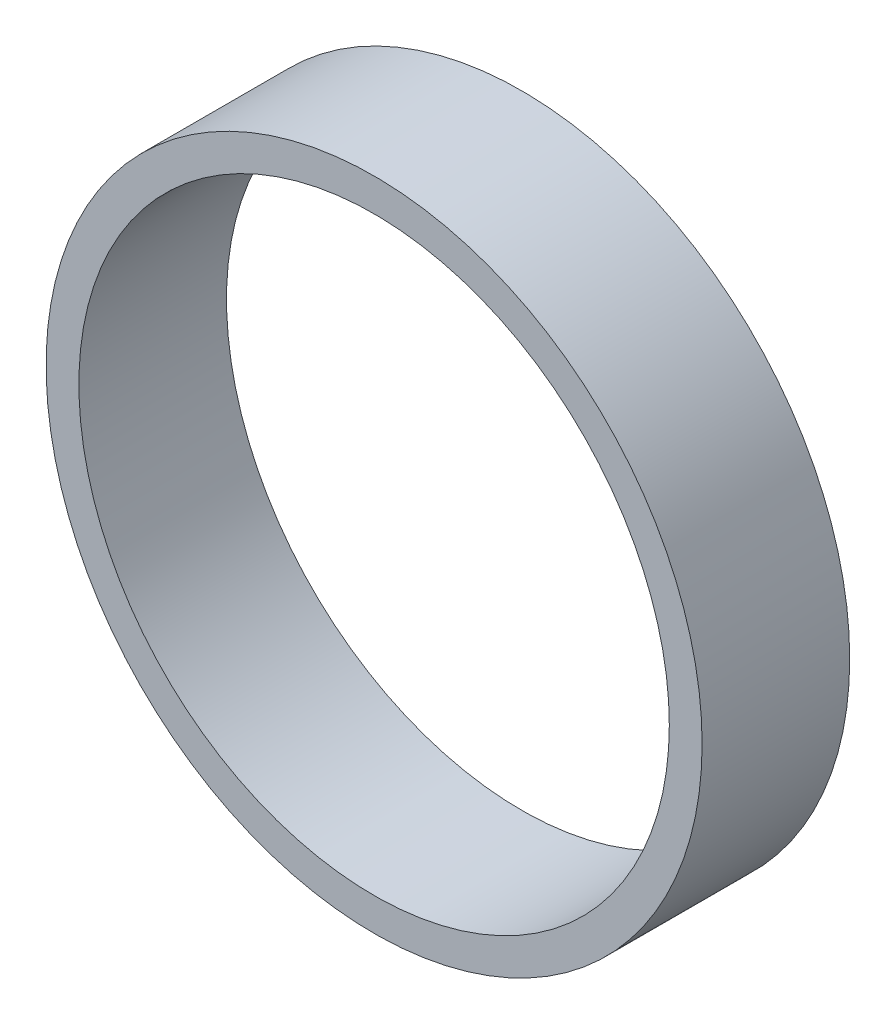
ISO-10303-21;
HEADER;
FILE_DESCRIPTION(('STEP AP214'),'2;1');
FILE_NAME('part.step','',(''),(''),'','','');
FILE_SCHEMA(('AUTOMOTIVE_DESIGN { 1 0 10303 214 1 1 1 1 }'));
ENDSEC;
DATA;
#1=APPLICATION_CONTEXT('core data for automotive mechanical design processes');
#2=APPLICATION_PROTOCOL_DEFINITION('international standard','automotive_design',2000,#1);
#3=PRODUCT_CONTEXT('',#1,'mechanical');
#4=PRODUCT('Part','Part','',(#3));
#5=PRODUCT_RELATED_PRODUCT_CATEGORY('part','',(#4));
#6=PRODUCT_DEFINITION_FORMATION('','',#4);
#7=PRODUCT_DEFINITION_CONTEXT('part definition',#1,'design');
#8=PRODUCT_DEFINITION('design','',#6,#7);
#9=PRODUCT_DEFINITION_SHAPE('','',#8);
#10=(LENGTH_UNIT() NAMED_UNIT(*) SI_UNIT(.MILLI.,.METRE.));
#11=(NAMED_UNIT(*) PLANE_ANGLE_UNIT() SI_UNIT($,.RADIAN.));
#12=(NAMED_UNIT(*) SI_UNIT($,.STERADIAN.) SOLID_ANGLE_UNIT());
#13=UNCERTAINTY_MEASURE_WITH_UNIT(LENGTH_MEASURE(1.E-05),#10,'distance_accuracy_value','');
#14=(GEOMETRIC_REPRESENTATION_CONTEXT(3) GLOBAL_UNCERTAINTY_ASSIGNED_CONTEXT((#13)) GLOBAL_UNIT_ASSIGNED_CONTEXT((#10,
#11,#12)) REPRESENTATION_CONTEXT('',''));
#15=CARTESIAN_POINT('',(0.,0.,0.));
#16=DIRECTION('',(0.,0.,1.));
#17=DIRECTION('',(1.,0.,0.));
#18=AXIS2_PLACEMENT_3D('',#15,#16,#17);
#19=CARTESIAN_POINT('',(0.,0.,11.43));
#20=DIRECTION('',(0.,0.,-1.));
#21=DIRECTION('',(-1.,0.,0.));
#22=AXIS2_PLACEMENT_3D('',#19,#20,#21);
#23=CYLINDRICAL_SURFACE('',#22,25.4);
#24=CARTESIAN_POINT('',(0.,0.,11.43));
#25=DIRECTION('',(0.,0.,1.));
#26=DIRECTION('',(1.,0.,0.));
#27=AXIS2_PLACEMENT_3D('',#24,#25,#26);
#28=CIRCLE('',#27,25.4);
#29=CARTESIAN_POINT('',(25.4,0.,11.43));
#30=VERTEX_POINT('',#29);
#31=EDGE_CURVE('E10',#30,#30,#28,.T.);
#32=ORIENTED_EDGE('',*,*,#31,.F.);
#33=EDGE_LOOP('',(#32));
#34=FACE_BOUND('',#33,.T.);
#35=CARTESIAN_POINT('',(0.,0.,0.));
#36=DIRECTION('',(0.,0.,1.));
#37=DIRECTION('',(1.,0.,0.));
#38=AXIS2_PLACEMENT_3D('',#35,#36,#37);
#39=CIRCLE('',#38,25.4);
#40=CARTESIAN_POINT('',(25.4,0.,0.));
#41=VERTEX_POINT('',#40);
#42=EDGE_CURVE('E36',#41,#41,#39,.T.);
#43=ORIENTED_EDGE('',*,*,#42,.T.);
#44=EDGE_LOOP('',(#43));
#45=FACE_BOUND('',#44,.T.);
#46=ADVANCED_FACE('F33',(#34,#45),#23,.T.);
#47=CARTESIAN_POINT('',(0.,0.,11.43));
#48=DIRECTION('',(0.,0.,1.));
#49=DIRECTION('',(1.,0.,0.));
#50=AXIS2_PLACEMENT_3D('',#47,#48,#49);
#51=PLANE('',#50);
#52=CARTESIAN_POINT('',(0.,0.,11.43));
#53=DIRECTION('',(0.,0.,1.));
#54=DIRECTION('',(1.,0.,0.));
#55=AXIS2_PLACEMENT_3D('',#52,#53,#54);
#56=CIRCLE('',#55,22.86);
#57=CARTESIAN_POINT('',(22.86,0.,11.43));
#58=VERTEX_POINT('',#57);
#59=EDGE_CURVE('E45',#58,#58,#56,.T.);
#60=ORIENTED_EDGE('',*,*,#59,.F.);
#61=EDGE_LOOP('',(#60));
#62=FACE_BOUND('',#61,.T.);
#63=ORIENTED_EDGE('',*,*,#31,.T.);
#64=EDGE_LOOP('',(#63));
#65=FACE_BOUND('',#64,.T.);
#66=ADVANCED_FACE('F60',(#62,#65),#51,.T.);
#67=CARTESIAN_POINT('',(0.,0.,0.));
#68=DIRECTION('',(0.,0.,1.));
#69=DIRECTION('',(1.,0.,0.));
#70=AXIS2_PLACEMENT_3D('',#67,#68,#69);
#71=PLANE('',#70);
#72=CARTESIAN_POINT('',(0.,0.,0.));
#73=DIRECTION('',(0.,0.,1.));
#74=DIRECTION('',(1.,0.,0.));
#75=AXIS2_PLACEMENT_3D('',#72,#73,#74);
#76=CIRCLE('',#75,22.86);
#77=CARTESIAN_POINT('',(22.86,0.,0.));
#78=VERTEX_POINT('',#77);
#79=EDGE_CURVE('E43',#78,#78,#76,.T.);
#80=ORIENTED_EDGE('',*,*,#79,.T.);
#81=EDGE_LOOP('',(#80));
#82=FACE_BOUND('',#81,.T.);
#83=ORIENTED_EDGE('',*,*,#42,.F.);
#84=EDGE_LOOP('',(#83));
#85=FACE_BOUND('',#84,.T.);
#86=ADVANCED_FACE('F51',(#82,#85),#71,.F.);
#87=CARTESIAN_POINT('',(0.,0.,0.));
#88=DIRECTION('',(0.,0.,1.));
#89=DIRECTION('',(1.,0.,0.));
#90=AXIS2_PLACEMENT_3D('',#87,#88,#89);
#91=CYLINDRICAL_SURFACE('',#90,22.86);
#92=ORIENTED_EDGE('',*,*,#79,.F.);
#93=EDGE_LOOP('',(#92));
#94=FACE_BOUND('',#93,.T.);
#95=ORIENTED_EDGE('',*,*,#59,.T.);
#96=EDGE_LOOP('',(#95));
#97=FACE_BOUND('',#96,.T.);
#98=ADVANCED_FACE('F54',(#94,#97),#91,.F.);
#99=CLOSED_SHELL('',(#46,#66,#86,#98));
#100=MANIFOLD_SOLID_BREP('B2',#99);
#101=ADVANCED_BREP_SHAPE_REPRESENTATION('',(#18,#100),#14);
#102=SHAPE_DEFINITION_REPRESENTATION(#9,#101);
ENDSEC;
END-ISO-10303-21;
